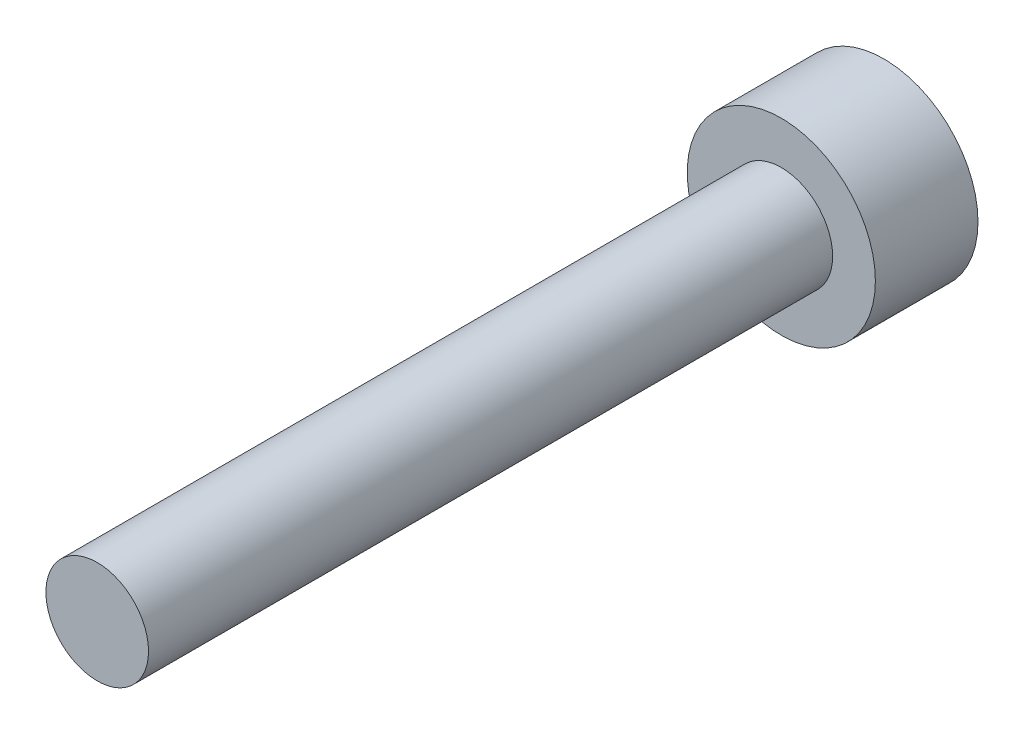
ISO-10303-21;
HEADER;
FILE_DESCRIPTION(('STEP AP214'),'2;1');
FILE_NAME('part.step','',(''),(''),'','','');
FILE_SCHEMA(('AUTOMOTIVE_DESIGN { 1 0 10303 214 1 1 1 1 }'));
ENDSEC;
DATA;
#1=APPLICATION_CONTEXT('core data for automotive mechanical design processes');
#2=APPLICATION_PROTOCOL_DEFINITION('international standard','automotive_design',2000,#1);
#3=PRODUCT_CONTEXT('',#1,'mechanical');
#4=PRODUCT('Part','Part','',(#3));
#5=PRODUCT_RELATED_PRODUCT_CATEGORY('part','',(#4));
#6=PRODUCT_DEFINITION_FORMATION('','',#4);
#7=PRODUCT_DEFINITION_CONTEXT('part definition',#1,'design');
#8=PRODUCT_DEFINITION('design','',#6,#7);
#9=PRODUCT_DEFINITION_SHAPE('','',#8);
#10=(LENGTH_UNIT() NAMED_UNIT(*) SI_UNIT(.MILLI.,.METRE.));
#11=(NAMED_UNIT(*) PLANE_ANGLE_UNIT() SI_UNIT($,.RADIAN.));
#12=(NAMED_UNIT(*) SI_UNIT($,.STERADIAN.) SOLID_ANGLE_UNIT());
#13=UNCERTAINTY_MEASURE_WITH_UNIT(LENGTH_MEASURE(1.E-05),#10,'distance_accuracy_value','');
#14=(GEOMETRIC_REPRESENTATION_CONTEXT(3) GLOBAL_UNCERTAINTY_ASSIGNED_CONTEXT((#13)) GLOBAL_UNIT_ASSIGNED_CONTEXT((#10,
#11,#12)) REPRESENTATION_CONTEXT('',''));
#15=CARTESIAN_POINT('',(0.,0.,0.));
#16=DIRECTION('',(0.,0.,1.));
#17=DIRECTION('',(1.,0.,0.));
#18=AXIS2_PLACEMENT_3D('',#15,#16,#17);
#19=CARTESIAN_POINT('',(0.,0.,-3.));
#20=DIRECTION('',(0.,0.,1.));
#21=DIRECTION('',(1.,0.,0.));
#22=AXIS2_PLACEMENT_3D('',#19,#20,#21);
#23=PLANE('',#22);
#24=CARTESIAN_POINT('',(0.,0.,-3.));
#25=DIRECTION('',(0.,0.,1.));
#26=DIRECTION('',(1.,0.,0.));
#27=AXIS2_PLACEMENT_3D('',#24,#25,#26);
#28=CIRCLE('',#27,2.75);
#29=CARTESIAN_POINT('',(2.75,0.,-3.));
#30=VERTEX_POINT('',#29);
#31=EDGE_CURVE('E47',#30,#30,#28,.T.);
#32=ORIENTED_EDGE('',*,*,#31,.F.);
#33=EDGE_LOOP('',(#32));
#34=FACE_BOUND('',#33,.T.);
#35=DIRECTION('',(0.5,0.866025403784439,0.));
#36=VECTOR('',#35,1.);
#37=CARTESIAN_POINT('',(0.721687836487032,-1.25,-3.));
#38=LINE('',#37,#36);
#39=CARTESIAN_POINT('',(0.721687836487032,-1.25,-3.));
#40=VERTEX_POINT('',#39);
#41=CARTESIAN_POINT('',(1.44337567297406,0.,-3.));
#42=VERTEX_POINT('',#41);
#43=EDGE_CURVE('E62',#40,#42,#38,.T.);
#44=ORIENTED_EDGE('',*,*,#43,.T.);
#45=DIRECTION('',(-0.5,0.866025403784439,0.));
#46=VECTOR('',#45,1.);
#47=CARTESIAN_POINT('',(1.44337567297406,0.,-3.));
#48=LINE('',#47,#46);
#49=CARTESIAN_POINT('',(0.721687836487032,1.25,-3.));
#50=VERTEX_POINT('',#49);
#51=EDGE_CURVE('E138',#42,#50,#48,.T.);
#52=ORIENTED_EDGE('',*,*,#51,.T.);
#53=DIRECTION('',(-1.,0.,0.));
#54=VECTOR('',#53,1.);
#55=CARTESIAN_POINT('',(0.721687836487032,1.25,-3.));
#56=LINE('',#55,#54);
#57=CARTESIAN_POINT('',(-0.721687836487032,1.25,-3.));
#58=VERTEX_POINT('',#57);
#59=EDGE_CURVE('E141',#50,#58,#56,.T.);
#60=ORIENTED_EDGE('',*,*,#59,.T.);
#61=DIRECTION('',(-0.5,-0.866025403784439,0.));
#62=VECTOR('',#61,1.);
#63=CARTESIAN_POINT('',(-0.721687836487032,1.25,-3.));
#64=LINE('',#63,#62);
#65=CARTESIAN_POINT('',(-1.44337567297406,0.,-3.));
#66=VERTEX_POINT('',#65);
#67=EDGE_CURVE('E150',#58,#66,#64,.T.);
#68=ORIENTED_EDGE('',*,*,#67,.T.);
#69=DIRECTION('',(0.5,-0.866025403784439,0.));
#70=VECTOR('',#69,1.);
#71=CARTESIAN_POINT('',(-1.44337567297406,0.,-3.));
#72=LINE('',#71,#70);
#73=CARTESIAN_POINT('',(-0.721687836487033,-1.25,-3.));
#74=VERTEX_POINT('',#73);
#75=EDGE_CURVE('E125',#66,#74,#72,.T.);
#76=ORIENTED_EDGE('',*,*,#75,.T.);
#77=DIRECTION('',(1.,0.,0.));
#78=VECTOR('',#77,1.);
#79=CARTESIAN_POINT('',(-0.721687836487033,-1.25,-3.));
#80=LINE('',#79,#78);
#81=EDGE_CURVE('E155',#74,#40,#80,.T.);
#82=ORIENTED_EDGE('',*,*,#81,.T.);
#83=EDGE_LOOP('',(#44,#52,#60,#68,#76,#82));
#84=FACE_BOUND('',#83,.T.);
#85=ADVANCED_FACE('F44',(#34,#84),#23,.F.);
#86=CARTESIAN_POINT('',(0.,0.,0.));
#87=DIRECTION('',(0.,0.,-1.));
#88=DIRECTION('',(-1.,0.,0.));
#89=AXIS2_PLACEMENT_3D('',#86,#87,#88);
#90=CYLINDRICAL_SURFACE('',#89,2.75);
#91=CARTESIAN_POINT('',(0.,0.,0.));
#92=DIRECTION('',(0.,0.,1.));
#93=DIRECTION('',(1.,0.,0.));
#94=AXIS2_PLACEMENT_3D('',#91,#92,#93);
#95=CIRCLE('',#94,2.75);
#96=CARTESIAN_POINT('',(2.75,0.,0.));
#97=VERTEX_POINT('',#96);
#98=EDGE_CURVE('E54',#97,#97,#95,.T.);
#99=ORIENTED_EDGE('',*,*,#98,.F.);
#100=EDGE_LOOP('',(#99));
#101=FACE_BOUND('',#100,.T.);
#102=ORIENTED_EDGE('',*,*,#31,.T.);
#103=EDGE_LOOP('',(#102));
#104=FACE_BOUND('',#103,.T.);
#105=ADVANCED_FACE('F50',(#101,#104),#90,.T.);
#106=CARTESIAN_POINT('',(0.,0.,0.));
#107=DIRECTION('',(0.,0.,1.));
#108=DIRECTION('',(1.,0.,0.));
#109=AXIS2_PLACEMENT_3D('',#106,#107,#108);
#110=PLANE('',#109);
#111=CARTESIAN_POINT('',(0.,0.,0.));
#112=DIRECTION('',(0.,0.,1.));
#113=DIRECTION('',(1.,0.,0.));
#114=AXIS2_PLACEMENT_3D('',#111,#112,#113);
#115=CIRCLE('',#114,1.5);
#116=CARTESIAN_POINT('',(1.5,0.,0.));
#117=VERTEX_POINT('',#116);
#118=EDGE_CURVE('E11',#117,#117,#115,.T.);
#119=ORIENTED_EDGE('',*,*,#118,.F.);
#120=EDGE_LOOP('',(#119));
#121=FACE_BOUND('',#120,.T.);
#122=ORIENTED_EDGE('',*,*,#98,.T.);
#123=EDGE_LOOP('',(#122));
#124=FACE_BOUND('',#123,.T.);
#125=ADVANCED_FACE('F212',(#121,#124),#110,.T.);
#126=CARTESIAN_POINT('',(0.,0.,20.));
#127=DIRECTION('',(0.,0.,-1.));
#128=DIRECTION('',(-1.,0.,0.));
#129=AXIS2_PLACEMENT_3D('',#126,#127,#128);
#130=CYLINDRICAL_SURFACE('',#129,1.5);
#131=CARTESIAN_POINT('',(0.,0.,20.));
#132=DIRECTION('',(0.,0.,1.));
#133=DIRECTION('',(1.,0.,0.));
#134=AXIS2_PLACEMENT_3D('',#131,#132,#133);
#135=CIRCLE('',#134,1.5);
#136=CARTESIAN_POINT('',(1.5,0.,20.));
#137=VERTEX_POINT('',#136);
#138=EDGE_CURVE('E166',#137,#137,#135,.T.);
#139=ORIENTED_EDGE('',*,*,#138,.F.);
#140=EDGE_LOOP('',(#139));
#141=FACE_BOUND('',#140,.T.);
#142=ORIENTED_EDGE('',*,*,#118,.T.);
#143=EDGE_LOOP('',(#142));
#144=FACE_BOUND('',#143,.T.);
#145=ADVANCED_FACE('F209',(#141,#144),#130,.T.);
#146=CARTESIAN_POINT('',(0.,0.,20.));
#147=DIRECTION('',(0.,0.,1.));
#148=DIRECTION('',(1.,0.,0.));
#149=AXIS2_PLACEMENT_3D('',#146,#147,#148);
#150=PLANE('',#149);
#151=ORIENTED_EDGE('',*,*,#138,.T.);
#152=EDGE_LOOP('',(#151));
#153=FACE_BOUND('',#152,.T.);
#154=ADVANCED_FACE('F204',(#153),#150,.T.);
#155=CARTESIAN_POINT('',(0.721687836487032,-1.25,-1.7));
#156=DIRECTION('',(-0.866025403784439,0.5,0.));
#157=DIRECTION('',(-0.5,-0.866025403784439,0.));
#158=AXIS2_PLACEMENT_3D('',#155,#156,#157);
#159=PLANE('',#158);
#160=ORIENTED_EDGE('',*,*,#43,.F.);
#161=DIRECTION('',(0.,0.,-1.));
#162=VECTOR('',#161,1.);
#163=CARTESIAN_POINT('',(0.721687836487032,-1.25,-1.7));
#164=LINE('',#163,#162);
#165=CARTESIAN_POINT('',(0.721687836487032,-1.25,-1.7));
#166=VERTEX_POINT('',#165);
#167=EDGE_CURVE('E132',#166,#40,#164,.T.);
#168=ORIENTED_EDGE('',*,*,#167,.F.);
#169=DIRECTION('',(0.5,0.866025403784439,0.));
#170=VECTOR('',#169,1.);
#171=CARTESIAN_POINT('',(0.721687836487032,-1.25,-1.7));
#172=LINE('',#171,#170);
#173=CARTESIAN_POINT('',(1.44337567297406,0.,-1.7));
#174=VERTEX_POINT('',#173);
#175=EDGE_CURVE('E156',#166,#174,#172,.T.);
#176=ORIENTED_EDGE('',*,*,#175,.T.);
#177=DIRECTION('',(0.,0.,-1.));
#178=VECTOR('',#177,1.);
#179=CARTESIAN_POINT('',(1.44337567297406,0.,-1.7));
#180=LINE('',#179,#178);
#181=EDGE_CURVE('E167',#174,#42,#180,.T.);
#182=ORIENTED_EDGE('',*,*,#181,.T.);
#183=EDGE_LOOP('',(#160,#168,#176,#182));
#184=FACE_BOUND('',#183,.T.);
#185=ADVANCED_FACE('F184',(#184),#159,.T.);
#186=CARTESIAN_POINT('',(1.44337567297406,0.,-1.7));
#187=DIRECTION('',(-0.866025403784439,-0.5,0.));
#188=DIRECTION('',(0.5,-0.866025403784439,0.));
#189=AXIS2_PLACEMENT_3D('',#186,#187,#188);
#190=PLANE('',#189);
#191=ORIENTED_EDGE('',*,*,#51,.F.);
#192=ORIENTED_EDGE('',*,*,#181,.F.);
#193=DIRECTION('',(-0.5,0.866025403784439,0.));
#194=VECTOR('',#193,1.);
#195=CARTESIAN_POINT('',(1.44337567297406,0.,-1.7));
#196=LINE('',#195,#194);
#197=CARTESIAN_POINT('',(0.721687836487032,1.25,-1.7));
#198=VERTEX_POINT('',#197);
#199=EDGE_CURVE('E105',#174,#198,#196,.T.);
#200=ORIENTED_EDGE('',*,*,#199,.T.);
#201=DIRECTION('',(0.,0.,-1.));
#202=VECTOR('',#201,1.);
#203=CARTESIAN_POINT('',(0.721687836487032,1.25,-1.7));
#204=LINE('',#203,#202);
#205=EDGE_CURVE('E162',#198,#50,#204,.T.);
#206=ORIENTED_EDGE('',*,*,#205,.T.);
#207=EDGE_LOOP('',(#191,#192,#200,#206));
#208=FACE_BOUND('',#207,.T.);
#209=ADVANCED_FACE('F198',(#208),#190,.T.);
#210=CARTESIAN_POINT('',(0.721687836487032,1.25,-1.7));
#211=DIRECTION('',(0.,-1.,0.));
#212=DIRECTION('',(1.,0.,0.));
#213=AXIS2_PLACEMENT_3D('',#210,#211,#212);
#214=PLANE('',#213);
#215=ORIENTED_EDGE('',*,*,#59,.F.);
#216=ORIENTED_EDGE('',*,*,#205,.F.);
#217=DIRECTION('',(-1.,0.,0.));
#218=VECTOR('',#217,1.);
#219=CARTESIAN_POINT('',(0.721687836487032,1.25,-1.7));
#220=LINE('',#219,#218);
#221=CARTESIAN_POINT('',(-0.721687836487032,1.25,-1.7));
#222=VERTEX_POINT('',#221);
#223=EDGE_CURVE('E121',#198,#222,#220,.T.);
#224=ORIENTED_EDGE('',*,*,#223,.T.);
#225=DIRECTION('',(0.,0.,-1.));
#226=VECTOR('',#225,1.);
#227=CARTESIAN_POINT('',(-0.721687836487032,1.25,-1.7));
#228=LINE('',#227,#226);
#229=EDGE_CURVE('E119',#222,#58,#228,.T.);
#230=ORIENTED_EDGE('',*,*,#229,.T.);
#231=EDGE_LOOP('',(#215,#216,#224,#230));
#232=FACE_BOUND('',#231,.T.);
#233=ADVANCED_FACE('F193',(#232),#214,.T.);
#234=CARTESIAN_POINT('',(-0.721687836487032,1.25,-1.7));
#235=DIRECTION('',(0.866025403784439,-0.5,0.));
#236=DIRECTION('',(0.5,0.866025403784439,0.));
#237=AXIS2_PLACEMENT_3D('',#234,#235,#236);
#238=PLANE('',#237);
#239=ORIENTED_EDGE('',*,*,#67,.F.);
#240=ORIENTED_EDGE('',*,*,#229,.F.);
#241=DIRECTION('',(-0.5,-0.866025403784439,0.));
#242=VECTOR('',#241,1.);
#243=CARTESIAN_POINT('',(-0.721687836487032,1.25,-1.7));
#244=LINE('',#243,#242);
#245=CARTESIAN_POINT('',(-1.44337567297406,0.,-1.7));
#246=VERTEX_POINT('',#245);
#247=EDGE_CURVE('E115',#222,#246,#244,.T.);
#248=ORIENTED_EDGE('',*,*,#247,.T.);
#249=DIRECTION('',(0.,0.,-1.));
#250=VECTOR('',#249,1.);
#251=CARTESIAN_POINT('',(-1.44337567297406,0.,-1.7));
#252=LINE('',#251,#250);
#253=EDGE_CURVE('E118',#246,#66,#252,.T.);
#254=ORIENTED_EDGE('',*,*,#253,.T.);
#255=EDGE_LOOP('',(#239,#240,#248,#254));
#256=FACE_BOUND('',#255,.T.);
#257=ADVANCED_FACE('F113',(#256),#238,.T.);
#258=CARTESIAN_POINT('',(-1.44337567297406,0.,-1.7));
#259=DIRECTION('',(0.866025403784439,0.5,0.));
#260=DIRECTION('',(-0.5,0.866025403784439,0.));
#261=AXIS2_PLACEMENT_3D('',#258,#259,#260);
#262=PLANE('',#261);
#263=ORIENTED_EDGE('',*,*,#75,.F.);
#264=ORIENTED_EDGE('',*,*,#253,.F.);
#265=DIRECTION('',(0.5,-0.866025403784439,0.));
#266=VECTOR('',#265,1.);
#267=CARTESIAN_POINT('',(-1.44337567297406,0.,-1.7));
#268=LINE('',#267,#266);
#269=CARTESIAN_POINT('',(-0.721687836487033,-1.25,-1.7));
#270=VERTEX_POINT('',#269);
#271=EDGE_CURVE('E116',#246,#270,#268,.T.);
#272=ORIENTED_EDGE('',*,*,#271,.T.);
#273=DIRECTION('',(0.,0.,-1.));
#274=VECTOR('',#273,1.);
#275=CARTESIAN_POINT('',(-0.721687836487033,-1.25,-1.7));
#276=LINE('',#275,#274);
#277=EDGE_CURVE('E91',#270,#74,#276,.T.);
#278=ORIENTED_EDGE('',*,*,#277,.T.);
#279=EDGE_LOOP('',(#263,#264,#272,#278));
#280=FACE_BOUND('',#279,.T.);
#281=ADVANCED_FACE('F124',(#280),#262,.T.);
#282=CARTESIAN_POINT('',(-0.721687836487033,-1.25,-1.7));
#283=DIRECTION('',(0.,1.,0.));
#284=DIRECTION('',(-1.,0.,0.));
#285=AXIS2_PLACEMENT_3D('',#282,#283,#284);
#286=PLANE('',#285);
#287=ORIENTED_EDGE('',*,*,#81,.F.);
#288=ORIENTED_EDGE('',*,*,#277,.F.);
#289=DIRECTION('',(1.,0.,0.));
#290=VECTOR('',#289,1.);
#291=CARTESIAN_POINT('',(-0.721687836487033,-1.25,-1.7));
#292=LINE('',#291,#290);
#293=EDGE_CURVE('E72',#270,#166,#292,.T.);
#294=ORIENTED_EDGE('',*,*,#293,.T.);
#295=ORIENTED_EDGE('',*,*,#167,.T.);
#296=EDGE_LOOP('',(#287,#288,#294,#295));
#297=FACE_BOUND('',#296,.T.);
#298=ADVANCED_FACE('F181',(#297),#286,.T.);
#299=CARTESIAN_POINT('',(0.,0.,-1.7));
#300=DIRECTION('',(0.,0.,1.));
#301=DIRECTION('',(1.,0.,0.));
#302=AXIS2_PLACEMENT_3D('',#299,#300,#301);
#303=PLANE('',#302);
#304=ORIENTED_EDGE('',*,*,#175,.F.);
#305=ORIENTED_EDGE('',*,*,#293,.F.);
#306=ORIENTED_EDGE('',*,*,#271,.F.);
#307=ORIENTED_EDGE('',*,*,#247,.F.);
#308=ORIENTED_EDGE('',*,*,#223,.F.);
#309=ORIENTED_EDGE('',*,*,#199,.F.);
#310=EDGE_LOOP('',(#304,#305,#306,#307,#308,#309));
#311=FACE_BOUND('',#310,.T.);
#312=ADVANCED_FACE('F129',(#311),#303,.F.);
#313=CLOSED_SHELL('',(#85,#105,#125,#145,#154,#185,#209,#233,#257,#281,#298,#312));
#314=MANIFOLD_SOLID_BREP('B2',#313);
#315=ADVANCED_BREP_SHAPE_REPRESENTATION('',(#18,#314),#14);
#316=SHAPE_DEFINITION_REPRESENTATION(#9,#315);
ENDSEC;
END-ISO-10303-21;
